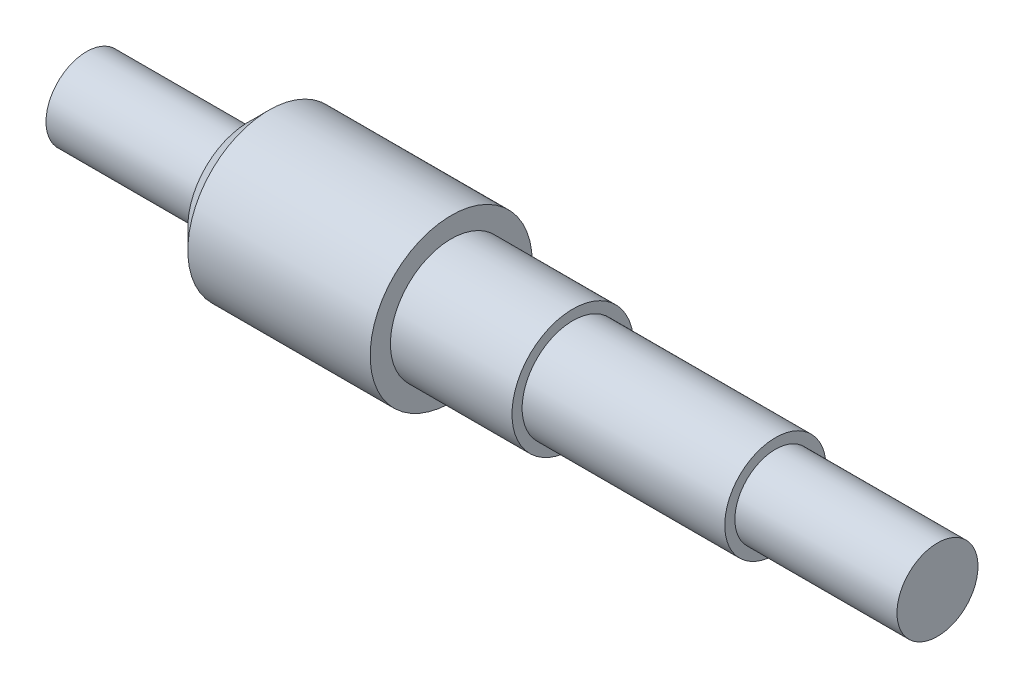
ISO-10303-21;
HEADER;
FILE_DESCRIPTION(('STEP AP214'),'2;1');
FILE_NAME('part.step','',(''),(''),'','','');
FILE_SCHEMA(('AUTOMOTIVE_DESIGN { 1 0 10303 214 1 1 1 1 }'));
ENDSEC;
DATA;
#1=APPLICATION_CONTEXT('core data for automotive mechanical design processes');
#2=APPLICATION_PROTOCOL_DEFINITION('international standard','automotive_design',2000,#1);
#3=PRODUCT_CONTEXT('',#1,'mechanical');
#4=PRODUCT('Part','Part','',(#3));
#5=PRODUCT_RELATED_PRODUCT_CATEGORY('part','',(#4));
#6=PRODUCT_DEFINITION_FORMATION('','',#4);
#7=PRODUCT_DEFINITION_CONTEXT('part definition',#1,'design');
#8=PRODUCT_DEFINITION('design','',#6,#7);
#9=PRODUCT_DEFINITION_SHAPE('','',#8);
#10=(LENGTH_UNIT() NAMED_UNIT(*) SI_UNIT(.MILLI.,.METRE.));
#11=(NAMED_UNIT(*) PLANE_ANGLE_UNIT() SI_UNIT($,.RADIAN.));
#12=(NAMED_UNIT(*) SI_UNIT($,.STERADIAN.) SOLID_ANGLE_UNIT());
#13=UNCERTAINTY_MEASURE_WITH_UNIT(LENGTH_MEASURE(1.E-05),#10,'distance_accuracy_value','');
#14=(GEOMETRIC_REPRESENTATION_CONTEXT(3) GLOBAL_UNCERTAINTY_ASSIGNED_CONTEXT((#13)) GLOBAL_UNIT_ASSIGNED_CONTEXT((#10,
#11,#12)) REPRESENTATION_CONTEXT('',''));
#15=CARTESIAN_POINT('',(0.,0.,0.));
#16=DIRECTION('',(0.,0.,1.));
#17=DIRECTION('',(1.,0.,0.));
#18=AXIS2_PLACEMENT_3D('',#15,#16,#17);
#19=CARTESIAN_POINT('',(26.,0.,0.));
#20=DIRECTION('',(-1.,0.,0.));
#21=DIRECTION('',(0.,0.,1.));
#22=AXIS2_PLACEMENT_3D('',#19,#20,#21);
#23=CYLINDRICAL_SURFACE('',#22,3.);
#24=CARTESIAN_POINT('',(10.,0.,0.));
#25=DIRECTION('',(1.,0.,0.));
#26=DIRECTION('',(0.,0.,-1.));
#27=AXIS2_PLACEMENT_3D('',#24,#25,#26);
#28=CIRCLE('',#27,3.);
#29=CARTESIAN_POINT('',(10.,0.,-3.));
#30=VERTEX_POINT('',#29);
#31=EDGE_CURVE('E69',#30,#30,#28,.T.);
#32=ORIENTED_EDGE('',*,*,#31,.T.);
#33=EDGE_LOOP('',(#32));
#34=FACE_BOUND('',#33,.T.);
#35=CARTESIAN_POINT('',(16.,0.,0.));
#36=DIRECTION('',(1.,0.,0.));
#37=DIRECTION('',(0.,0.,-1.));
#38=AXIS2_PLACEMENT_3D('',#35,#36,#37);
#39=CIRCLE('',#38,3.);
#40=CARTESIAN_POINT('',(16.,0.,-3.));
#41=VERTEX_POINT('',#40);
#42=EDGE_CURVE('E76',#41,#41,#39,.T.);
#43=ORIENTED_EDGE('',*,*,#42,.F.);
#44=EDGE_LOOP('',(#43));
#45=FACE_BOUND('',#44,.T.);
#46=ADVANCED_FACE('F46',(#34,#45),#23,.T.);
#47=CARTESIAN_POINT('',(10.,0.,0.));
#48=DIRECTION('',(1.,0.,0.));
#49=DIRECTION('',(0.,0.,-1.));
#50=AXIS2_PLACEMENT_3D('',#47,#48,#49);
#51=PLANE('',#50);
#52=CARTESIAN_POINT('',(10.,0.,0.));
#53=DIRECTION('',(1.,0.,0.));
#54=DIRECTION('',(0.,0.,-1.));
#55=AXIS2_PLACEMENT_3D('',#52,#53,#54);
#56=CIRCLE('',#55,4.);
#57=CARTESIAN_POINT('',(10.,0.,-4.));
#58=VERTEX_POINT('',#57);
#59=EDGE_CURVE('E61',#58,#58,#56,.T.);
#60=ORIENTED_EDGE('',*,*,#59,.T.);
#61=EDGE_LOOP('',(#60));
#62=FACE_BOUND('',#61,.T.);
#63=ORIENTED_EDGE('',*,*,#31,.F.);
#64=EDGE_LOOP('',(#63));
#65=FACE_BOUND('',#64,.T.);
#66=ADVANCED_FACE('F98',(#62,#65),#51,.T.);
#67=CARTESIAN_POINT('',(0.,0.,0.));
#68=DIRECTION('',(1.,0.,0.));
#69=DIRECTION('',(0.,0.,-1.));
#70=AXIS2_PLACEMENT_3D('',#67,#68,#69);
#71=PLANE('',#70);
#72=CARTESIAN_POINT('',(0.,0.,0.));
#73=DIRECTION('',(1.,0.,0.));
#74=DIRECTION('',(0.,0.,-1.));
#75=AXIS2_PLACEMENT_3D('',#72,#73,#74);
#76=CIRCLE('',#75,3.);
#77=CARTESIAN_POINT('',(0.,0.,-3.));
#78=VERTEX_POINT('',#77);
#79=EDGE_CURVE('E10',#78,#78,#76,.F.);
#80=ORIENTED_EDGE('',*,*,#79,.T.);
#81=EDGE_LOOP('',(#80));
#82=FACE_BOUND('',#81,.T.);
#83=CARTESIAN_POINT('',(0.,0.,0.));
#84=DIRECTION('',(1.,0.,0.));
#85=DIRECTION('',(0.,0.,-1.));
#86=AXIS2_PLACEMENT_3D('',#83,#84,#85);
#87=CIRCLE('',#86,2.);
#88=CARTESIAN_POINT('',(0.,0.,-2.));
#89=VERTEX_POINT('',#88);
#90=EDGE_CURVE('E57',#89,#89,#87,.F.);
#91=ORIENTED_EDGE('',*,*,#90,.F.);
#92=EDGE_LOOP('',(#91));
#93=FACE_BOUND('',#92,.T.);
#94=ADVANCED_FACE('F104',(#82,#93),#71,.F.);
#95=CARTESIAN_POINT('',(10.,0.,0.));
#96=DIRECTION('',(-1.,0.,0.));
#97=DIRECTION('',(0.,0.,1.));
#98=AXIS2_PLACEMENT_3D('',#95,#96,#97);
#99=CYLINDRICAL_SURFACE('',#98,4.);
#100=CARTESIAN_POINT('',(0.999999999999997,0.,0.));
#101=DIRECTION('',(1.,0.,0.));
#102=DIRECTION('',(0.,0.,-1.));
#103=AXIS2_PLACEMENT_3D('',#100,#101,#102);
#104=CIRCLE('',#103,4.);
#105=CARTESIAN_POINT('',(0.999999999999997,0.,-4.));
#106=VERTEX_POINT('',#105);
#107=EDGE_CURVE('E53',#106,#106,#104,.T.);
#108=ORIENTED_EDGE('',*,*,#107,.T.);
#109=EDGE_LOOP('',(#108));
#110=FACE_BOUND('',#109,.T.);
#111=ORIENTED_EDGE('',*,*,#59,.F.);
#112=EDGE_LOOP('',(#111));
#113=FACE_BOUND('',#112,.T.);
#114=ADVANCED_FACE('F117',(#110,#113),#99,.T.);
#115=CARTESIAN_POINT('',(-8.,0.,0.));
#116=DIRECTION('',(1.,0.,0.));
#117=DIRECTION('',(0.,0.,-1.));
#118=AXIS2_PLACEMENT_3D('',#115,#116,#117);
#119=CYLINDRICAL_SURFACE('',#118,2.);
#120=CARTESIAN_POINT('',(-8.,0.,0.));
#121=DIRECTION('',(-1.,0.,0.));
#122=DIRECTION('',(0.,0.,1.));
#123=AXIS2_PLACEMENT_3D('',#120,#121,#122);
#124=CIRCLE('',#123,2.);
#125=CARTESIAN_POINT('',(-8.,0.,2.));
#126=VERTEX_POINT('',#125);
#127=EDGE_CURVE('E66',#126,#126,#124,.T.);
#128=ORIENTED_EDGE('',*,*,#127,.F.);
#129=EDGE_LOOP('',(#128));
#130=FACE_BOUND('',#129,.T.);
#131=ORIENTED_EDGE('',*,*,#90,.T.);
#132=EDGE_LOOP('',(#131));
#133=FACE_BOUND('',#132,.T.);
#134=ADVANCED_FACE('F114',(#130,#133),#119,.T.);
#135=CARTESIAN_POINT('',(-8.,0.,0.));
#136=DIRECTION('',(-1.,0.,0.));
#137=DIRECTION('',(0.,0.,1.));
#138=AXIS2_PLACEMENT_3D('',#135,#136,#137);
#139=PLANE('',#138);
#140=ORIENTED_EDGE('',*,*,#127,.T.);
#141=EDGE_LOOP('',(#140));
#142=FACE_BOUND('',#141,.T.);
#143=ADVANCED_FACE('F111',(#142),#139,.T.);
#144=CARTESIAN_POINT('',(0.999999999999997,0.,0.));
#145=DIRECTION('',(1.,0.,0.));
#146=DIRECTION('',(0.,0.,-1.));
#147=AXIS2_PLACEMENT_3D('',#144,#145,#146);
#148=CONICAL_SURFACE('',#147,4.,0.78539816339745);
#149=ORIENTED_EDGE('',*,*,#79,.F.);
#150=EDGE_LOOP('',(#149));
#151=FACE_BOUND('',#150,.T.);
#152=ORIENTED_EDGE('',*,*,#107,.F.);
#153=EDGE_LOOP('',(#152));
#154=FACE_BOUND('',#153,.T.);
#155=ADVANCED_FACE('F48',(#151,#154),#148,.T.);
#156=CARTESIAN_POINT('',(16.,0.,0.));
#157=DIRECTION('',(1.,0.,0.));
#158=DIRECTION('',(0.,0.,-1.));
#159=AXIS2_PLACEMENT_3D('',#156,#157,#158);
#160=PLANE('',#159);
#161=CARTESIAN_POINT('',(16.,0.,0.));
#162=DIRECTION('',(1.,0.,0.));
#163=DIRECTION('',(0.,0.,-1.));
#164=AXIS2_PLACEMENT_3D('',#161,#162,#163);
#165=CIRCLE('',#164,2.5);
#166=CARTESIAN_POINT('',(16.,0.,-2.5));
#167=VERTEX_POINT('',#166);
#168=EDGE_CURVE('E81',#167,#167,#165,.T.);
#169=ORIENTED_EDGE('',*,*,#168,.F.);
#170=EDGE_LOOP('',(#169));
#171=FACE_BOUND('',#170,.T.);
#172=ORIENTED_EDGE('',*,*,#42,.T.);
#173=EDGE_LOOP('',(#172));
#174=FACE_BOUND('',#173,.T.);
#175=ADVANCED_FACE('F91',(#171,#174),#160,.T.);
#176=CARTESIAN_POINT('',(16.,0.,0.));
#177=DIRECTION('',(1.,0.,0.));
#178=DIRECTION('',(0.,0.,-1.));
#179=AXIS2_PLACEMENT_3D('',#176,#177,#178);
#180=CYLINDRICAL_SURFACE('',#179,2.5);
#181=ORIENTED_EDGE('',*,*,#168,.T.);
#182=EDGE_LOOP('',(#181));
#183=FACE_BOUND('',#182,.T.);
#184=CARTESIAN_POINT('',(26.,0.,0.));
#185=DIRECTION('',(1.,0.,0.));
#186=DIRECTION('',(0.,0.,-1.));
#187=AXIS2_PLACEMENT_3D('',#184,#185,#186);
#188=CIRCLE('',#187,2.5);
#189=CARTESIAN_POINT('',(26.,0.,-2.5));
#190=VERTEX_POINT('',#189);
#191=EDGE_CURVE('E82',#190,#190,#188,.T.);
#192=ORIENTED_EDGE('',*,*,#191,.F.);
#193=EDGE_LOOP('',(#192));
#194=FACE_BOUND('',#193,.T.);
#195=ADVANCED_FACE('F88',(#183,#194),#180,.T.);
#196=CARTESIAN_POINT('',(34.,0.,0.));
#197=DIRECTION('',(1.,0.,0.));
#198=DIRECTION('',(0.,0.,-1.));
#199=AXIS2_PLACEMENT_3D('',#196,#197,#198);
#200=PLANE('',#199);
#201=CARTESIAN_POINT('',(34.,0.,0.));
#202=DIRECTION('',(1.,0.,0.));
#203=DIRECTION('',(0.,0.,-1.));
#204=AXIS2_PLACEMENT_3D('',#201,#202,#203);
#205=CIRCLE('',#204,2.);
#206=CARTESIAN_POINT('',(34.,0.,-2.));
#207=VERTEX_POINT('',#206);
#208=EDGE_CURVE('E72',#207,#207,#205,.T.);
#209=ORIENTED_EDGE('',*,*,#208,.T.);
#210=EDGE_LOOP('',(#209));
#211=FACE_BOUND('',#210,.T.);
#212=ADVANCED_FACE('F158',(#211),#200,.T.);
#213=CARTESIAN_POINT('',(34.,0.,0.));
#214=DIRECTION('',(-1.,0.,0.));
#215=DIRECTION('',(0.,0.,1.));
#216=AXIS2_PLACEMENT_3D('',#213,#214,#215);
#217=CYLINDRICAL_SURFACE('',#216,2.);
#218=ORIENTED_EDGE('',*,*,#208,.F.);
#219=EDGE_LOOP('',(#218));
#220=FACE_BOUND('',#219,.T.);
#221=CARTESIAN_POINT('',(26.,0.,0.));
#222=DIRECTION('',(1.,0.,0.));
#223=DIRECTION('',(0.,0.,-1.));
#224=AXIS2_PLACEMENT_3D('',#221,#222,#223);
#225=CIRCLE('',#224,2.);
#226=CARTESIAN_POINT('',(26.,0.,-2.));
#227=VERTEX_POINT('',#226);
#228=EDGE_CURVE('E73',#227,#227,#225,.T.);
#229=ORIENTED_EDGE('',*,*,#228,.T.);
#230=EDGE_LOOP('',(#229));
#231=FACE_BOUND('',#230,.T.);
#232=ADVANCED_FACE('F166',(#220,#231),#217,.T.);
#233=CARTESIAN_POINT('',(26.,0.,0.));
#234=DIRECTION('',(1.,0.,0.));
#235=DIRECTION('',(0.,0.,-1.));
#236=AXIS2_PLACEMENT_3D('',#233,#234,#235);
#237=PLANE('',#236);
#238=ORIENTED_EDGE('',*,*,#228,.F.);
#239=EDGE_LOOP('',(#238));
#240=FACE_BOUND('',#239,.T.);
#241=ORIENTED_EDGE('',*,*,#191,.T.);
#242=EDGE_LOOP('',(#241));
#243=FACE_BOUND('',#242,.T.);
#244=ADVANCED_FACE('F109',(#240,#243),#237,.T.);
#245=CLOSED_SHELL('',(#46,#66,#94,#114,#134,#143,#155,#175,#195,#212,#232,#244));
#246=MANIFOLD_SOLID_BREP('B2',#245);
#247=ADVANCED_BREP_SHAPE_REPRESENTATION('',(#18,#246),#14);
#248=SHAPE_DEFINITION_REPRESENTATION(#9,#247);
ENDSEC;
END-ISO-10303-21;
